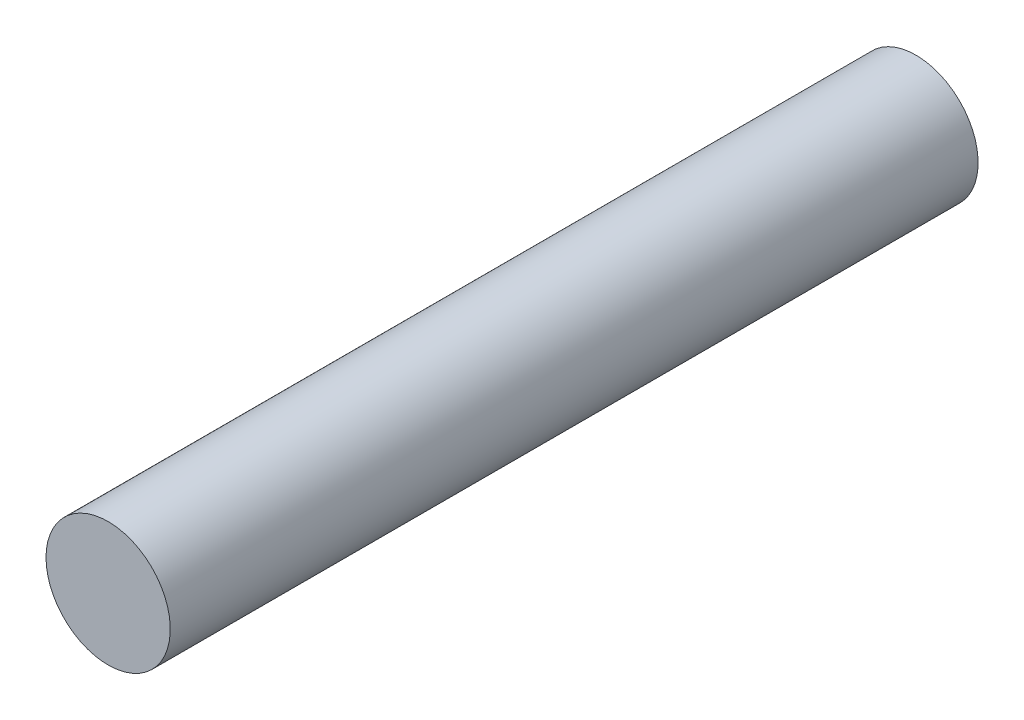
ISO-10303-21;
HEADER;
FILE_DESCRIPTION(('STEP AP214'),'2;1');
FILE_NAME('part.step','',(''),(''),'','','');
FILE_SCHEMA(('AUTOMOTIVE_DESIGN { 1 0 10303 214 1 1 1 1 }'));
ENDSEC;
DATA;
#1=APPLICATION_CONTEXT('core data for automotive mechanical design processes');
#2=APPLICATION_PROTOCOL_DEFINITION('international standard','automotive_design',2000,#1);
#3=PRODUCT_CONTEXT('',#1,'mechanical');
#4=PRODUCT('Part','Part','',(#3));
#5=PRODUCT_RELATED_PRODUCT_CATEGORY('part','',(#4));
#6=PRODUCT_DEFINITION_FORMATION('','',#4);
#7=PRODUCT_DEFINITION_CONTEXT('part definition',#1,'design');
#8=PRODUCT_DEFINITION('design','',#6,#7);
#9=PRODUCT_DEFINITION_SHAPE('','',#8);
#10=(LENGTH_UNIT() NAMED_UNIT(*) SI_UNIT(.MILLI.,.METRE.));
#11=(NAMED_UNIT(*) PLANE_ANGLE_UNIT() SI_UNIT($,.RADIAN.));
#12=(NAMED_UNIT(*) SI_UNIT($,.STERADIAN.) SOLID_ANGLE_UNIT());
#13=UNCERTAINTY_MEASURE_WITH_UNIT(LENGTH_MEASURE(1.E-05),#10,'distance_accuracy_value','');
#14=(GEOMETRIC_REPRESENTATION_CONTEXT(3) GLOBAL_UNCERTAINTY_ASSIGNED_CONTEXT((#13)) GLOBAL_UNIT_ASSIGNED_CONTEXT((#10,
#11,#12)) REPRESENTATION_CONTEXT('',''));
#15=CARTESIAN_POINT('',(0.,0.,0.));
#16=DIRECTION('',(0.,0.,1.));
#17=DIRECTION('',(1.,0.,0.));
#18=AXIS2_PLACEMENT_3D('',#15,#16,#17);
#19=CARTESIAN_POINT('',(0.,0.,26.));
#20=DIRECTION('',(0.,0.,-1.));
#21=DIRECTION('',(-1.,0.,0.));
#22=AXIS2_PLACEMENT_3D('',#19,#20,#21);
#23=CYLINDRICAL_SURFACE('',#22,2.);
#24=CARTESIAN_POINT('',(0.,0.,26.));
#25=DIRECTION('',(0.,0.,1.));
#26=DIRECTION('',(1.,0.,0.));
#27=AXIS2_PLACEMENT_3D('',#24,#25,#26);
#28=CIRCLE('',#27,2.);
#29=CARTESIAN_POINT('',(-2.,0.,26.));
#30=VERTEX_POINT('',#29);
#31=EDGE_CURVE('E10',#30,#30,#28,.T.);
#32=CARTESIAN_POINT('',(0.,0.,0.));
#33=DIRECTION('',(0.,0.,1.));
#34=DIRECTION('',(1.,0.,0.));
#35=AXIS2_PLACEMENT_3D('',#32,#33,#34);
#36=CIRCLE('',#35,2.);
#37=CARTESIAN_POINT('',(-2.,0.,0.));
#38=VERTEX_POINT('',#37);
#39=EDGE_CURVE('E40',#38,#38,#36,.T.);
#40=CARTESIAN_POINT('',(-2.,0.,26.));
#41=CARTESIAN_POINT('',(-2.,0.,25.7291666666667));
#42=CARTESIAN_POINT('',(-2.,0.,25.4583333333333));
#43=CARTESIAN_POINT('',(-2.,0.,24.9166666666667));
#44=CARTESIAN_POINT('',(-2.,0.,24.6458333333333));
#45=CARTESIAN_POINT('',(-2.,0.,24.1041666666667));
#46=CARTESIAN_POINT('',(-2.,0.,23.8333333333333));
#47=CARTESIAN_POINT('',(-2.,0.,23.2916666666667));
#48=CARTESIAN_POINT('',(-2.,0.,23.0208333333333));
#49=CARTESIAN_POINT('',(-2.,0.,22.4791666666667));
#50=CARTESIAN_POINT('',(-2.,0.,22.2083333333333));
#51=CARTESIAN_POINT('',(-2.,0.,21.6666666666667));
#52=CARTESIAN_POINT('',(-2.,0.,21.3958333333333));
#53=CARTESIAN_POINT('',(-2.,0.,20.8541666666667));
#54=CARTESIAN_POINT('',(-2.,0.,20.5833333333333));
#55=CARTESIAN_POINT('',(-2.,0.,20.0416666666667));
#56=CARTESIAN_POINT('',(-2.,0.,19.7708333333333));
#57=CARTESIAN_POINT('',(-2.,0.,19.2291666666667));
#58=CARTESIAN_POINT('',(-2.,0.,18.9583333333333));
#59=CARTESIAN_POINT('',(-2.,0.,18.4166666666667));
#60=CARTESIAN_POINT('',(-2.,0.,18.1458333333333));
#61=CARTESIAN_POINT('',(-2.,0.,17.6041666666667));
#62=CARTESIAN_POINT('',(-2.,0.,17.3333333333333));
#63=CARTESIAN_POINT('',(-2.,0.,16.7916666666667));
#64=CARTESIAN_POINT('',(-2.,0.,16.5208333333333));
#65=CARTESIAN_POINT('',(-2.,0.,15.9791666666667));
#66=CARTESIAN_POINT('',(-2.,0.,15.7083333333333));
#67=CARTESIAN_POINT('',(-2.,0.,15.1666666666667));
#68=CARTESIAN_POINT('',(-2.,0.,14.8958333333333));
#69=CARTESIAN_POINT('',(-2.,0.,14.3541666666667));
#70=CARTESIAN_POINT('',(-2.,0.,14.0833333333333));
#71=CARTESIAN_POINT('',(-2.,0.,13.5416666666667));
#72=CARTESIAN_POINT('',(-2.,0.,13.2708333333333));
#73=CARTESIAN_POINT('',(-2.,0.,12.7291666666667));
#74=CARTESIAN_POINT('',(-2.,0.,12.4583333333333));
#75=CARTESIAN_POINT('',(-2.,0.,11.9166666666667));
#76=CARTESIAN_POINT('',(-2.,0.,11.6458333333333));
#77=CARTESIAN_POINT('',(-2.,0.,11.1041666666667));
#78=CARTESIAN_POINT('',(-2.,0.,10.8333333333333));
#79=CARTESIAN_POINT('',(-2.,0.,10.2916666666667));
#80=CARTESIAN_POINT('',(-2.,0.,10.0208333333333));
#81=CARTESIAN_POINT('',(-2.,0.,9.47916666666667));
#82=CARTESIAN_POINT('',(-2.,0.,9.20833333333333));
#83=CARTESIAN_POINT('',(-2.,0.,8.66666666666667));
#84=CARTESIAN_POINT('',(-2.,0.,8.39583333333333));
#85=CARTESIAN_POINT('',(-2.,0.,7.85416666666667));
#86=CARTESIAN_POINT('',(-2.,0.,7.58333333333333));
#87=CARTESIAN_POINT('',(-2.,0.,7.04166666666667));
#88=CARTESIAN_POINT('',(-2.,0.,6.77083333333333));
#89=CARTESIAN_POINT('',(-2.,0.,6.22916666666667));
#90=CARTESIAN_POINT('',(-2.,0.,5.95833333333333));
#91=CARTESIAN_POINT('',(-2.,0.,5.41666666666667));
#92=CARTESIAN_POINT('',(-2.,0.,5.14583333333333));
#93=CARTESIAN_POINT('',(-2.,0.,4.60416666666667));
#94=CARTESIAN_POINT('',(-2.,0.,4.33333333333333));
#95=CARTESIAN_POINT('',(-2.,0.,3.79166666666667));
#96=CARTESIAN_POINT('',(-2.,0.,3.52083333333333));
#97=CARTESIAN_POINT('',(-2.,0.,2.97916666666667));
#98=CARTESIAN_POINT('',(-2.,0.,2.70833333333333));
#99=CARTESIAN_POINT('',(-2.,0.,2.16666666666667));
#100=CARTESIAN_POINT('',(-2.,0.,1.89583333333333));
#101=CARTESIAN_POINT('',(-2.,0.,1.35416666666667));
#102=CARTESIAN_POINT('',(-2.,0.,1.08333333333333));
#103=CARTESIAN_POINT('',(-2.,0.,0.541666666666667));
#104=CARTESIAN_POINT('',(-2.,0.,0.270833333333334));
#105=CARTESIAN_POINT('',(-2.,0.,0.));
#106=B_SPLINE_CURVE_WITH_KNOTS('',3,(#40,#41,#42,#43,#44,#45,#46,#47,#48,#49,#50,#51,#52,#53,
#54,#55,#56,#57,#58,#59,#60,#61,#62,#63,#64,#65,#66,#67,#68,#69,#70,#71,#72,#73,#74,#75,#76,#77,
#78,#79,#80,#81,#82,#83,#84,#85,#86,#87,#88,#89,#90,#91,#92,#93,#94,#95,#96,#97,#98,#99,#100,
#101,#102,#103,#104,#105),.UNSPECIFIED.,.F.,.F.,(4,2,2,2,2,2,2,2,2,2,2,2,2,2,2,2,2,2,2,2,2,2,2,
2,2,2,2,2,2,2,2,2,4),(0.,0.812500000000001,1.625,2.4375,3.25,4.0625,4.875,5.6875,6.5,7.3125,
8.125,8.9375,9.75,10.5625,11.375,12.1875,13.,13.8125,14.625,15.4375,16.25,17.0625,17.875,
18.6875,19.5,20.3125,21.125,21.9375,22.75,23.5625,24.375,25.1875,26.),.UNSPECIFIED.);
#107=EDGE_CURVE('BSEAM37',#30,#38,#106,.T.);
#108=ORIENTED_EDGE('',*,*,#31,.F.);
#109=ORIENTED_EDGE('',*,*,#39,.T.);
#110=ORIENTED_EDGE('',*,*,#107,.T.);
#111=ORIENTED_EDGE('',*,*,#107,.F.);
#112=EDGE_LOOP('',(#108,#110,#109,#111));
#113=FACE_BOUND('',#112,.T.);
#114=ADVANCED_FACE('F37',(#113),#23,.T.);
#115=CARTESIAN_POINT('',(0.,0.,26.));
#116=DIRECTION('',(0.,0.,1.));
#117=DIRECTION('',(1.,0.,0.));
#118=AXIS2_PLACEMENT_3D('',#115,#116,#117);
#119=PLANE('',#118);
#120=ORIENTED_EDGE('',*,*,#31,.T.);
#121=EDGE_LOOP('',(#120));
#122=FACE_BOUND('',#121,.T.);
#123=ADVANCED_FACE('F54',(#122),#119,.T.);
#124=CARTESIAN_POINT('',(0.,0.,0.));
#125=DIRECTION('',(0.,0.,1.));
#126=DIRECTION('',(1.,0.,0.));
#127=AXIS2_PLACEMENT_3D('',#124,#125,#126);
#128=PLANE('',#127);
#129=ORIENTED_EDGE('',*,*,#39,.F.);
#130=EDGE_LOOP('',(#129));
#131=FACE_BOUND('',#130,.T.);
#132=ADVANCED_FACE('F52',(#131),#128,.F.);
#133=CLOSED_SHELL('',(#114,#123,#132));
#134=MANIFOLD_SOLID_BREP('B2',#133);
#135=ADVANCED_BREP_SHAPE_REPRESENTATION('',(#18,#134),#14);
#136=SHAPE_DEFINITION_REPRESENTATION(#9,#135);
ENDSEC;
END-ISO-10303-21;
